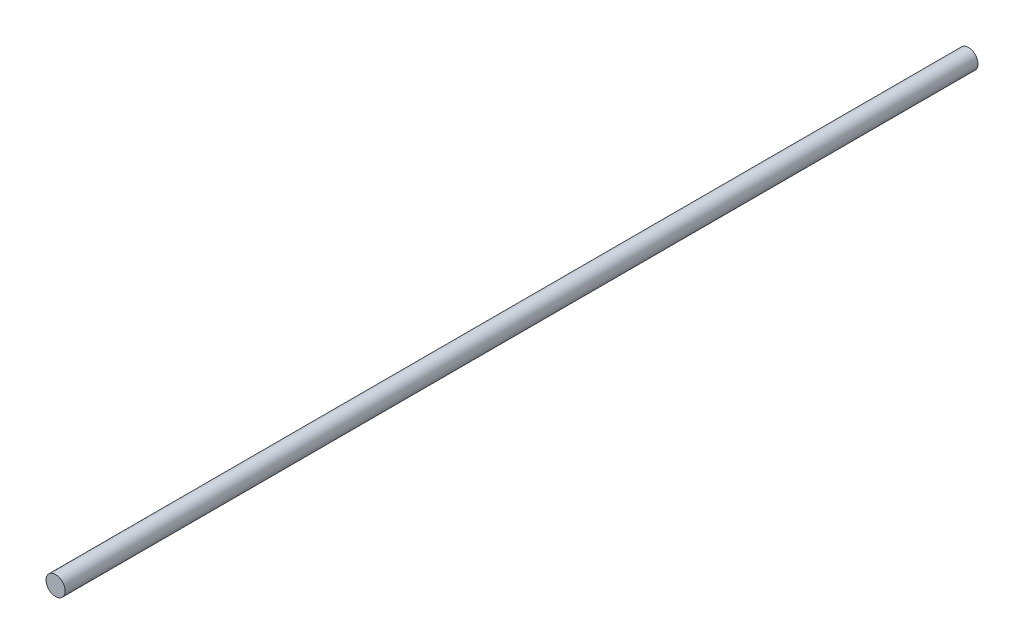
ISO-10303-21;
HEADER;
FILE_DESCRIPTION(('STEP AP214'),'2;1');
FILE_NAME('part.step','',(''),(''),'','','');
FILE_SCHEMA(('AUTOMOTIVE_DESIGN { 1 0 10303 214 1 1 1 1 }'));
ENDSEC;
DATA;
#1=APPLICATION_CONTEXT('core data for automotive mechanical design processes');
#2=APPLICATION_PROTOCOL_DEFINITION('international standard','automotive_design',2000,#1);
#3=PRODUCT_CONTEXT('',#1,'mechanical');
#4=PRODUCT('Part','Part','',(#3));
#5=PRODUCT_RELATED_PRODUCT_CATEGORY('part','',(#4));
#6=PRODUCT_DEFINITION_FORMATION('','',#4);
#7=PRODUCT_DEFINITION_CONTEXT('part definition',#1,'design');
#8=PRODUCT_DEFINITION('design','',#6,#7);
#9=PRODUCT_DEFINITION_SHAPE('','',#8);
#10=(LENGTH_UNIT() NAMED_UNIT(*) SI_UNIT(.MILLI.,.METRE.));
#11=(NAMED_UNIT(*) PLANE_ANGLE_UNIT() SI_UNIT($,.RADIAN.));
#12=(NAMED_UNIT(*) SI_UNIT($,.STERADIAN.) SOLID_ANGLE_UNIT());
#13=UNCERTAINTY_MEASURE_WITH_UNIT(LENGTH_MEASURE(1.E-05),#10,'distance_accuracy_value','');
#14=(GEOMETRIC_REPRESENTATION_CONTEXT(3) GLOBAL_UNCERTAINTY_ASSIGNED_CONTEXT((#13)) GLOBAL_UNIT_ASSIGNED_CONTEXT((#10,
#11,#12)) REPRESENTATION_CONTEXT('',''));
#15=CARTESIAN_POINT('',(0.,0.,0.));
#16=DIRECTION('',(0.,0.,1.));
#17=DIRECTION('',(1.,0.,0.));
#18=AXIS2_PLACEMENT_3D('',#15,#16,#17);
#19=CARTESIAN_POINT('',(0.,0.,23.876));
#20=DIRECTION('',(0.,0.,-1.));
#21=DIRECTION('',(-1.,0.,0.));
#22=AXIS2_PLACEMENT_3D('',#19,#20,#21);
#23=CYLINDRICAL_SURFACE('',#22,0.5);
#24=CARTESIAN_POINT('',(0.,0.,23.876));
#25=DIRECTION('',(0.,0.,1.));
#26=DIRECTION('',(1.,0.,0.));
#27=AXIS2_PLACEMENT_3D('',#24,#25,#26);
#28=CIRCLE('',#27,0.5);
#29=CARTESIAN_POINT('',(0.5,0.,23.876));
#30=VERTEX_POINT('',#29);
#31=EDGE_CURVE('E10',#30,#30,#28,.T.);
#32=ORIENTED_EDGE('',*,*,#31,.F.);
#33=EDGE_LOOP('',(#32));
#34=FACE_BOUND('',#33,.T.);
#35=CARTESIAN_POINT('',(0.,0.,-23.876));
#36=DIRECTION('',(0.,0.,1.));
#37=DIRECTION('',(1.,0.,0.));
#38=AXIS2_PLACEMENT_3D('',#35,#36,#37);
#39=CIRCLE('',#38,0.5);
#40=CARTESIAN_POINT('',(0.5,0.,-23.876));
#41=VERTEX_POINT('',#40);
#42=EDGE_CURVE('E34',#41,#41,#39,.T.);
#43=ORIENTED_EDGE('',*,*,#42,.T.);
#44=EDGE_LOOP('',(#43));
#45=FACE_BOUND('',#44,.T.);
#46=ADVANCED_FACE('F31',(#34,#45),#23,.T.);
#47=CARTESIAN_POINT('',(0.,0.,23.876));
#48=DIRECTION('',(0.,0.,1.));
#49=DIRECTION('',(1.,0.,0.));
#50=AXIS2_PLACEMENT_3D('',#47,#48,#49);
#51=PLANE('',#50);
#52=ORIENTED_EDGE('',*,*,#31,.T.);
#53=EDGE_LOOP('',(#52));
#54=FACE_BOUND('',#53,.T.);
#55=ADVANCED_FACE('F46',(#54),#51,.T.);
#56=CARTESIAN_POINT('',(0.,0.,-23.876));
#57=DIRECTION('',(0.,0.,1.));
#58=DIRECTION('',(1.,0.,0.));
#59=AXIS2_PLACEMENT_3D('',#56,#57,#58);
#60=PLANE('',#59);
#61=ORIENTED_EDGE('',*,*,#42,.F.);
#62=EDGE_LOOP('',(#61));
#63=FACE_BOUND('',#62,.T.);
#64=ADVANCED_FACE('F44',(#63),#60,.F.);
#65=CLOSED_SHELL('',(#46,#55,#64));
#66=MANIFOLD_SOLID_BREP('B2',#65);
#67=ADVANCED_BREP_SHAPE_REPRESENTATION('',(#18,#66),#14);
#68=SHAPE_DEFINITION_REPRESENTATION(#9,#67);
ENDSEC;
END-ISO-10303-21;
